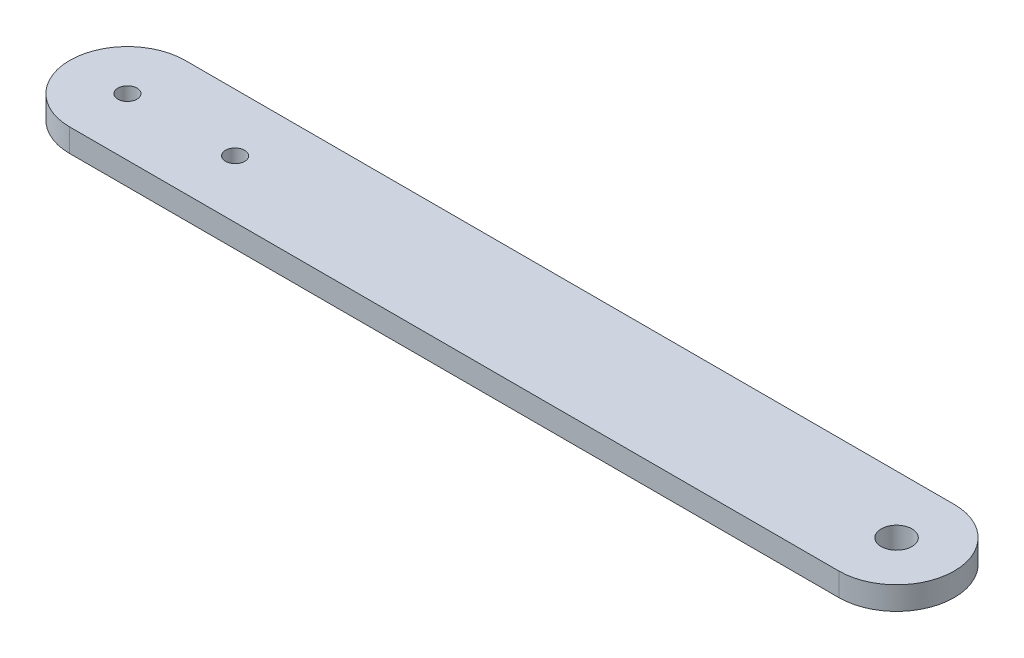
ISO-10303-21;
HEADER;
FILE_DESCRIPTION(('STEP AP214'),'2;1');
FILE_NAME('part.step','',(''),(''),'','','');
FILE_SCHEMA(('AUTOMOTIVE_DESIGN { 1 0 10303 214 1 1 1 1 }'));
ENDSEC;
DATA;
#1=APPLICATION_CONTEXT('core data for automotive mechanical design processes');
#2=APPLICATION_PROTOCOL_DEFINITION('international standard','automotive_design',2000,#1);
#3=PRODUCT_CONTEXT('',#1,'mechanical');
#4=PRODUCT('Part','Part','',(#3));
#5=PRODUCT_RELATED_PRODUCT_CATEGORY('part','',(#4));
#6=PRODUCT_DEFINITION_FORMATION('','',#4);
#7=PRODUCT_DEFINITION_CONTEXT('part definition',#1,'design');
#8=PRODUCT_DEFINITION('design','',#6,#7);
#9=PRODUCT_DEFINITION_SHAPE('','',#8);
#10=(LENGTH_UNIT() NAMED_UNIT(*) SI_UNIT(.MILLI.,.METRE.));
#11=(NAMED_UNIT(*) PLANE_ANGLE_UNIT() SI_UNIT($,.RADIAN.));
#12=(NAMED_UNIT(*) SI_UNIT($,.STERADIAN.) SOLID_ANGLE_UNIT());
#13=UNCERTAINTY_MEASURE_WITH_UNIT(LENGTH_MEASURE(1.E-05),#10,'distance_accuracy_value','');
#14=(GEOMETRIC_REPRESENTATION_CONTEXT(3) GLOBAL_UNCERTAINTY_ASSIGNED_CONTEXT((#13)) GLOBAL_UNIT_ASSIGNED_CONTEXT((#10,
#11,#12)) REPRESENTATION_CONTEXT('',''));
#15=CARTESIAN_POINT('',(0.,0.,0.));
#16=DIRECTION('',(0.,0.,1.));
#17=DIRECTION('',(1.,0.,0.));
#18=AXIS2_PLACEMENT_3D('',#15,#16,#17);
#19=CARTESIAN_POINT('',(0.,3.,0.));
#20=DIRECTION('',(0.,1.,0.));
#21=DIRECTION('',(0.,0.,1.));
#22=AXIS2_PLACEMENT_3D('',#19,#20,#21);
#23=PLANE('',#22);
#24=CARTESIAN_POINT('',(0.,3.,0.));
#25=DIRECTION('',(0.,1.,0.));
#26=DIRECTION('',(0.,0.,1.));
#27=AXIS2_PLACEMENT_3D('',#24,#25,#26);
#28=CIRCLE('',#27,1.25);
#29=CARTESIAN_POINT('',(0.,3.,1.25));
#30=VERTEX_POINT('',#29);
#31=EDGE_CURVE('E115',#30,#30,#28,.T.);
#32=ORIENTED_EDGE('',*,*,#31,.F.);
#33=EDGE_LOOP('',(#32));
#34=FACE_BOUND('',#33,.T.);
#35=CARTESIAN_POINT('',(0.,3.,0.));
#36=DIRECTION('',(0.,1.,0.));
#37=DIRECTION('',(0.,0.,1.));
#38=AXIS2_PLACEMENT_3D('',#35,#36,#37);
#39=CIRCLE('',#38,7.5);
#40=CARTESIAN_POINT('',(0.,3.,-7.5));
#41=VERTEX_POINT('',#40);
#42=CARTESIAN_POINT('',(0.,3.,7.5));
#43=VERTEX_POINT('',#42);
#44=EDGE_CURVE('E85',#41,#43,#39,.T.);
#45=ORIENTED_EDGE('',*,*,#44,.T.);
#46=DIRECTION('',(1.,0.,0.));
#47=VECTOR('',#46,1.);
#48=CARTESIAN_POINT('',(0.,3.,7.5));
#49=LINE('',#48,#47);
#50=CARTESIAN_POINT('',(100.,3.,7.5));
#51=VERTEX_POINT('',#50);
#52=EDGE_CURVE('E80',#43,#51,#49,.T.);
#53=ORIENTED_EDGE('',*,*,#52,.T.);
#54=CARTESIAN_POINT('',(100.,3.,0.));
#55=DIRECTION('',(0.,1.,0.));
#56=DIRECTION('',(0.,0.,1.));
#57=AXIS2_PLACEMENT_3D('',#54,#55,#56);
#58=CIRCLE('',#57,7.5);
#59=CARTESIAN_POINT('',(100.,3.,-7.5));
#60=VERTEX_POINT('',#59);
#61=EDGE_CURVE('E83',#51,#60,#58,.T.);
#62=ORIENTED_EDGE('',*,*,#61,.T.);
#63=DIRECTION('',(-1.,0.,0.));
#64=VECTOR('',#63,1.);
#65=CARTESIAN_POINT('',(0.,3.,-7.5));
#66=LINE('',#65,#64);
#67=EDGE_CURVE('E50',#60,#41,#66,.T.);
#68=ORIENTED_EDGE('',*,*,#67,.T.);
#69=EDGE_LOOP('',(#45,#53,#62,#68));
#70=FACE_BOUND('',#69,.T.);
#71=CARTESIAN_POINT('',(100.,3.,0.));
#72=DIRECTION('',(0.,1.,0.));
#73=DIRECTION('',(0.,0.,1.));
#74=AXIS2_PLACEMENT_3D('',#71,#72,#73);
#75=CIRCLE('',#74,2.);
#76=CARTESIAN_POINT('',(100.,3.,2.));
#77=VERTEX_POINT('',#76);
#78=EDGE_CURVE('E100',#77,#77,#75,.T.);
#79=ORIENTED_EDGE('',*,*,#78,.F.);
#80=EDGE_LOOP('',(#79));
#81=FACE_BOUND('',#80,.T.);
#82=CARTESIAN_POINT('',(14.,3.,0.));
#83=DIRECTION('',(0.,1.,0.));
#84=DIRECTION('',(0.,0.,1.));
#85=AXIS2_PLACEMENT_3D('',#82,#83,#84);
#86=CIRCLE('',#85,1.25);
#87=CARTESIAN_POINT('',(14.,3.,1.25));
#88=VERTEX_POINT('',#87);
#89=EDGE_CURVE('E121',#88,#88,#86,.T.);
#90=ORIENTED_EDGE('',*,*,#89,.F.);
#91=EDGE_LOOP('',(#90));
#92=FACE_BOUND('',#91,.T.);
#93=ADVANCED_FACE('F33',(#34,#70,#81,#92),#23,.T.);
#94=CARTESIAN_POINT('',(0.,0.,0.));
#95=DIRECTION('',(0.,1.,0.));
#96=DIRECTION('',(0.,0.,1.));
#97=AXIS2_PLACEMENT_3D('',#94,#95,#96);
#98=PLANE('',#97);
#99=CARTESIAN_POINT('',(0.,0.,0.));
#100=DIRECTION('',(0.,1.,0.));
#101=DIRECTION('',(0.,0.,1.));
#102=AXIS2_PLACEMENT_3D('',#99,#100,#101);
#103=CIRCLE('',#102,7.5);
#104=CARTESIAN_POINT('',(0.,0.,-7.5));
#105=VERTEX_POINT('',#104);
#106=CARTESIAN_POINT('',(0.,0.,7.5));
#107=VERTEX_POINT('',#106);
#108=EDGE_CURVE('E97',#105,#107,#103,.T.);
#109=ORIENTED_EDGE('',*,*,#108,.F.);
#110=DIRECTION('',(-1.,0.,0.));
#111=VECTOR('',#110,1.);
#112=CARTESIAN_POINT('',(0.,0.,-7.5));
#113=LINE('',#112,#111);
#114=CARTESIAN_POINT('',(100.,0.,-7.5));
#115=VERTEX_POINT('',#114);
#116=EDGE_CURVE('E73',#115,#105,#113,.T.);
#117=ORIENTED_EDGE('',*,*,#116,.F.);
#118=CARTESIAN_POINT('',(100.,0.,0.));
#119=DIRECTION('',(0.,1.,0.));
#120=DIRECTION('',(0.,0.,1.));
#121=AXIS2_PLACEMENT_3D('',#118,#119,#120);
#122=CIRCLE('',#121,7.5);
#123=CARTESIAN_POINT('',(100.,0.,7.5));
#124=VERTEX_POINT('',#123);
#125=EDGE_CURVE('E67',#124,#115,#122,.T.);
#126=ORIENTED_EDGE('',*,*,#125,.F.);
#127=DIRECTION('',(1.,0.,0.));
#128=VECTOR('',#127,1.);
#129=CARTESIAN_POINT('',(0.,0.,7.5));
#130=LINE('',#129,#128);
#131=EDGE_CURVE('E89',#107,#124,#130,.T.);
#132=ORIENTED_EDGE('',*,*,#131,.F.);
#133=EDGE_LOOP('',(#109,#117,#126,#132));
#134=FACE_BOUND('',#133,.T.);
#135=CARTESIAN_POINT('',(100.,0.,0.));
#136=DIRECTION('',(0.,1.,0.));
#137=DIRECTION('',(0.,0.,1.));
#138=AXIS2_PLACEMENT_3D('',#135,#136,#137);
#139=CIRCLE('',#138,2.);
#140=CARTESIAN_POINT('',(100.,0.,2.));
#141=VERTEX_POINT('',#140);
#142=EDGE_CURVE('E112',#141,#141,#139,.T.);
#143=ORIENTED_EDGE('',*,*,#142,.T.);
#144=EDGE_LOOP('',(#143));
#145=FACE_BOUND('',#144,.T.);
#146=CARTESIAN_POINT('',(0.,0.,0.));
#147=DIRECTION('',(0.,1.,0.));
#148=DIRECTION('',(0.,0.,1.));
#149=AXIS2_PLACEMENT_3D('',#146,#147,#148);
#150=CIRCLE('',#149,1.25);
#151=CARTESIAN_POINT('',(0.,0.,1.25));
#152=VERTEX_POINT('',#151);
#153=EDGE_CURVE('E118',#152,#152,#150,.T.);
#154=ORIENTED_EDGE('',*,*,#153,.T.);
#155=EDGE_LOOP('',(#154));
#156=FACE_BOUND('',#155,.T.);
#157=CARTESIAN_POINT('',(14.,0.,0.));
#158=DIRECTION('',(0.,1.,0.));
#159=DIRECTION('',(0.,0.,1.));
#160=AXIS2_PLACEMENT_3D('',#157,#158,#159);
#161=CIRCLE('',#160,1.25);
#162=CARTESIAN_POINT('',(14.,0.,1.25));
#163=VERTEX_POINT('',#162);
#164=EDGE_CURVE('E124',#163,#163,#161,.T.);
#165=ORIENTED_EDGE('',*,*,#164,.T.);
#166=EDGE_LOOP('',(#165));
#167=FACE_BOUND('',#166,.T.);
#168=ADVANCED_FACE('F108',(#134,#145,#156,#167),#98,.F.);
#169=CARTESIAN_POINT('',(0.,3.,0.));
#170=DIRECTION('',(0.,-1.,0.));
#171=DIRECTION('',(0.,0.,-1.));
#172=AXIS2_PLACEMENT_3D('',#169,#170,#171);
#173=CYLINDRICAL_SURFACE('',#172,7.5);
#174=ORIENTED_EDGE('',*,*,#108,.T.);
#175=DIRECTION('',(0.,-1.,0.));
#176=VECTOR('',#175,1.);
#177=CARTESIAN_POINT('',(0.,3.,7.5));
#178=LINE('',#177,#176);
#179=EDGE_CURVE('E11',#43,#107,#178,.T.);
#180=ORIENTED_EDGE('',*,*,#179,.F.);
#181=ORIENTED_EDGE('',*,*,#44,.F.);
#182=DIRECTION('',(0.,-1.,0.));
#183=VECTOR('',#182,1.);
#184=CARTESIAN_POINT('',(0.,3.,-7.5));
#185=LINE('',#184,#183);
#186=EDGE_CURVE('E93',#41,#105,#185,.T.);
#187=ORIENTED_EDGE('',*,*,#186,.T.);
#188=EDGE_LOOP('',(#174,#180,#181,#187));
#189=FACE_BOUND('',#188,.T.);
#190=ADVANCED_FACE('F35',(#189),#173,.T.);
#191=CARTESIAN_POINT('',(0.,3.,7.5));
#192=DIRECTION('',(0.,0.,-1.));
#193=DIRECTION('',(-1.,0.,0.));
#194=AXIS2_PLACEMENT_3D('',#191,#192,#193);
#195=PLANE('',#194);
#196=ORIENTED_EDGE('',*,*,#131,.T.);
#197=DIRECTION('',(0.,-1.,0.));
#198=VECTOR('',#197,1.);
#199=CARTESIAN_POINT('',(100.,3.,7.5));
#200=LINE('',#199,#198);
#201=EDGE_CURVE('E42',#51,#124,#200,.T.);
#202=ORIENTED_EDGE('',*,*,#201,.F.);
#203=ORIENTED_EDGE('',*,*,#52,.F.);
#204=ORIENTED_EDGE('',*,*,#179,.T.);
#205=EDGE_LOOP('',(#196,#202,#203,#204));
#206=FACE_BOUND('',#205,.T.);
#207=ADVANCED_FACE('F88',(#206),#195,.F.);
#208=CARTESIAN_POINT('',(100.,3.,0.));
#209=DIRECTION('',(0.,-1.,0.));
#210=DIRECTION('',(0.,0.,-1.));
#211=AXIS2_PLACEMENT_3D('',#208,#209,#210);
#212=CYLINDRICAL_SURFACE('',#211,7.5);
#213=ORIENTED_EDGE('',*,*,#125,.T.);
#214=DIRECTION('',(0.,-1.,0.));
#215=VECTOR('',#214,1.);
#216=CARTESIAN_POINT('',(100.,3.,-7.5));
#217=LINE('',#216,#215);
#218=EDGE_CURVE('E90',#60,#115,#217,.T.);
#219=ORIENTED_EDGE('',*,*,#218,.F.);
#220=ORIENTED_EDGE('',*,*,#61,.F.);
#221=ORIENTED_EDGE('',*,*,#201,.T.);
#222=EDGE_LOOP('',(#213,#219,#220,#221));
#223=FACE_BOUND('',#222,.T.);
#224=ADVANCED_FACE('F91',(#223),#212,.T.);
#225=CARTESIAN_POINT('',(0.,3.,-7.5));
#226=DIRECTION('',(0.,0.,1.));
#227=DIRECTION('',(1.,0.,0.));
#228=AXIS2_PLACEMENT_3D('',#225,#226,#227);
#229=PLANE('',#228);
#230=ORIENTED_EDGE('',*,*,#116,.T.);
#231=ORIENTED_EDGE('',*,*,#186,.F.);
#232=ORIENTED_EDGE('',*,*,#67,.F.);
#233=ORIENTED_EDGE('',*,*,#218,.T.);
#234=EDGE_LOOP('',(#230,#231,#232,#233));
#235=FACE_BOUND('',#234,.T.);
#236=ADVANCED_FACE('F105',(#235),#229,.F.);
#237=CARTESIAN_POINT('',(100.,3.,0.));
#238=DIRECTION('',(0.,-1.,0.));
#239=DIRECTION('',(0.,0.,-1.));
#240=AXIS2_PLACEMENT_3D('',#237,#238,#239);
#241=CYLINDRICAL_SURFACE('',#240,2.);
#242=ORIENTED_EDGE('',*,*,#78,.T.);
#243=EDGE_LOOP('',(#242));
#244=FACE_BOUND('',#243,.T.);
#245=ORIENTED_EDGE('',*,*,#142,.F.);
#246=EDGE_LOOP('',(#245));
#247=FACE_BOUND('',#246,.T.);
#248=ADVANCED_FACE('F142',(#244,#247),#241,.F.);
#249=CARTESIAN_POINT('',(0.,3.,0.));
#250=DIRECTION('',(0.,-1.,0.));
#251=DIRECTION('',(0.,0.,-1.));
#252=AXIS2_PLACEMENT_3D('',#249,#250,#251);
#253=CYLINDRICAL_SURFACE('',#252,1.25);
#254=ORIENTED_EDGE('',*,*,#31,.T.);
#255=EDGE_LOOP('',(#254));
#256=FACE_BOUND('',#255,.T.);
#257=ORIENTED_EDGE('',*,*,#153,.F.);
#258=EDGE_LOOP('',(#257));
#259=FACE_BOUND('',#258,.T.);
#260=ADVANCED_FACE('F188',(#256,#259),#253,.F.);
#261=CARTESIAN_POINT('',(14.,3.,0.));
#262=DIRECTION('',(0.,-1.,0.));
#263=DIRECTION('',(0.,0.,-1.));
#264=AXIS2_PLACEMENT_3D('',#261,#262,#263);
#265=CYLINDRICAL_SURFACE('',#264,1.25);
#266=ORIENTED_EDGE('',*,*,#89,.T.);
#267=EDGE_LOOP('',(#266));
#268=FACE_BOUND('',#267,.T.);
#269=ORIENTED_EDGE('',*,*,#164,.F.);
#270=EDGE_LOOP('',(#269));
#271=FACE_BOUND('',#270,.T.);
#272=ADVANCED_FACE('F130',(#268,#271),#265,.F.);
#273=CLOSED_SHELL('',(#93,#168,#190,#207,#224,#236,#248,#260,#272));
#274=MANIFOLD_SOLID_BREP('B2',#273);
#275=ADVANCED_BREP_SHAPE_REPRESENTATION('',(#18,#274),#14);
#276=SHAPE_DEFINITION_REPRESENTATION(#9,#275);
ENDSEC;
END-ISO-10303-21;
